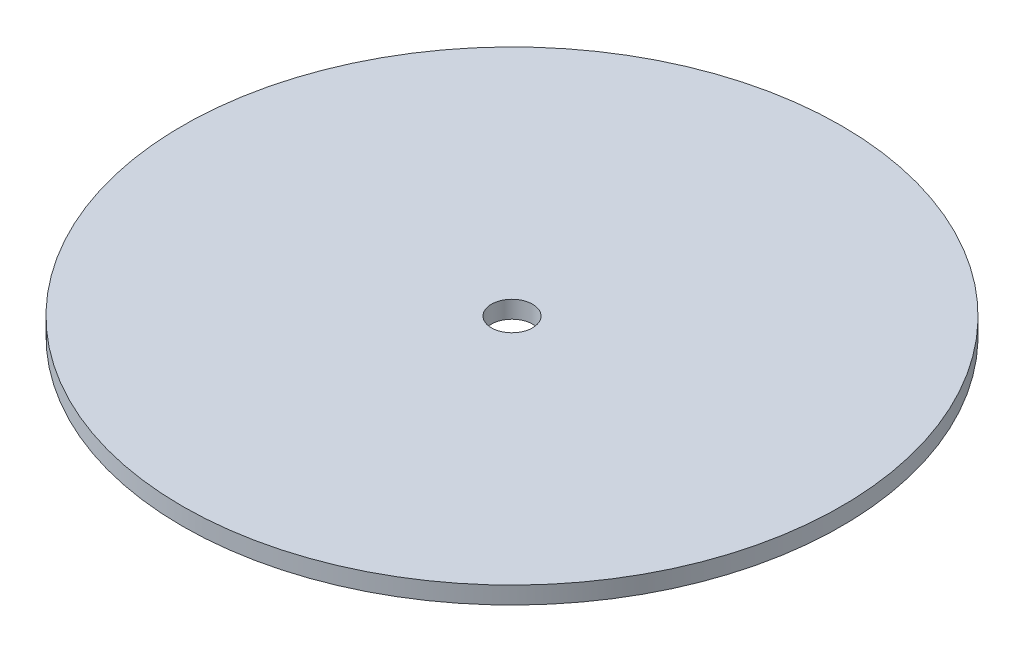
ISO-10303-21;
HEADER;
FILE_DESCRIPTION(('STEP AP214'),'2;1');
FILE_NAME('part.step','',(''),(''),'','','');
FILE_SCHEMA(('AUTOMOTIVE_DESIGN { 1 0 10303 214 1 1 1 1 }'));
ENDSEC;
DATA;
#1=APPLICATION_CONTEXT('core data for automotive mechanical design processes');
#2=APPLICATION_PROTOCOL_DEFINITION('international standard','automotive_design',2000,#1);
#3=PRODUCT_CONTEXT('',#1,'mechanical');
#4=PRODUCT('Part','Part','',(#3));
#5=PRODUCT_RELATED_PRODUCT_CATEGORY('part','',(#4));
#6=PRODUCT_DEFINITION_FORMATION('','',#4);
#7=PRODUCT_DEFINITION_CONTEXT('part definition',#1,'design');
#8=PRODUCT_DEFINITION('design','',#6,#7);
#9=PRODUCT_DEFINITION_SHAPE('','',#8);
#10=(LENGTH_UNIT() NAMED_UNIT(*) SI_UNIT(.MILLI.,.METRE.));
#11=(NAMED_UNIT(*) PLANE_ANGLE_UNIT() SI_UNIT($,.RADIAN.));
#12=(NAMED_UNIT(*) SI_UNIT($,.STERADIAN.) SOLID_ANGLE_UNIT());
#13=UNCERTAINTY_MEASURE_WITH_UNIT(LENGTH_MEASURE(1.E-05),#10,'distance_accuracy_value','');
#14=(GEOMETRIC_REPRESENTATION_CONTEXT(3) GLOBAL_UNCERTAINTY_ASSIGNED_CONTEXT((#13)) GLOBAL_UNIT_ASSIGNED_CONTEXT((#10,
#11,#12)) REPRESENTATION_CONTEXT('',''));
#15=CARTESIAN_POINT('',(0.,0.,0.));
#16=DIRECTION('',(0.,0.,1.));
#17=DIRECTION('',(1.,0.,0.));
#18=AXIS2_PLACEMENT_3D('',#15,#16,#17);
#19=CARTESIAN_POINT('',(0.,4.,0.));
#20=DIRECTION('',(0.,1.,0.));
#21=DIRECTION('',(0.,0.,1.));
#22=AXIS2_PLACEMENT_3D('',#19,#20,#21);
#23=PLANE('',#22);
#24=CARTESIAN_POINT('',(0.,4.,0.));
#25=DIRECTION('',(0.,1.,0.));
#26=DIRECTION('',(0.,0.,1.));
#27=AXIS2_PLACEMENT_3D('',#24,#25,#26);
#28=CIRCLE('',#27,76.2);
#29=CARTESIAN_POINT('',(0.,4.,76.2));
#30=VERTEX_POINT('',#29);
#31=EDGE_CURVE('E10',#30,#30,#28,.T.);
#32=ORIENTED_EDGE('',*,*,#31,.T.);
#33=EDGE_LOOP('',(#32));
#34=FACE_BOUND('',#33,.T.);
#35=CARTESIAN_POINT('',(0.,4.,0.));
#36=DIRECTION('',(0.,1.,0.));
#37=DIRECTION('',(0.,0.,1.));
#38=AXIS2_PLACEMENT_3D('',#35,#36,#37);
#39=CIRCLE('',#38,4.75);
#40=CARTESIAN_POINT('',(0.,4.,4.75));
#41=VERTEX_POINT('',#40);
#42=EDGE_CURVE('E46',#41,#41,#39,.T.);
#43=ORIENTED_EDGE('',*,*,#42,.F.);
#44=EDGE_LOOP('',(#43));
#45=FACE_BOUND('',#44,.T.);
#46=ADVANCED_FACE('F35',(#34,#45),#23,.T.);
#47=CARTESIAN_POINT('',(0.,0.,0.));
#48=DIRECTION('',(0.,1.,0.));
#49=DIRECTION('',(0.,0.,1.));
#50=AXIS2_PLACEMENT_3D('',#47,#48,#49);
#51=PLANE('',#50);
#52=CARTESIAN_POINT('',(0.,0.,0.));
#53=DIRECTION('',(0.,1.,0.));
#54=DIRECTION('',(0.,0.,1.));
#55=AXIS2_PLACEMENT_3D('',#52,#53,#54);
#56=CIRCLE('',#55,76.2);
#57=CARTESIAN_POINT('',(0.,0.,76.2));
#58=VERTEX_POINT('',#57);
#59=EDGE_CURVE('E39',#58,#58,#56,.T.);
#60=ORIENTED_EDGE('',*,*,#59,.F.);
#61=EDGE_LOOP('',(#60));
#62=FACE_BOUND('',#61,.T.);
#63=CARTESIAN_POINT('',(0.,0.,0.));
#64=DIRECTION('',(0.,1.,0.));
#65=DIRECTION('',(0.,0.,1.));
#66=AXIS2_PLACEMENT_3D('',#63,#64,#65);
#67=CIRCLE('',#66,4.75);
#68=CARTESIAN_POINT('',(0.,0.,4.75));
#69=VERTEX_POINT('',#68);
#70=EDGE_CURVE('E48',#69,#69,#67,.T.);
#71=ORIENTED_EDGE('',*,*,#70,.T.);
#72=EDGE_LOOP('',(#71));
#73=FACE_BOUND('',#72,.T.);
#74=ADVANCED_FACE('F58',(#62,#73),#51,.F.);
#75=CARTESIAN_POINT('',(0.,4.,0.));
#76=DIRECTION('',(0.,-1.,0.));
#77=DIRECTION('',(0.,0.,-1.));
#78=AXIS2_PLACEMENT_3D('',#75,#76,#77);
#79=CYLINDRICAL_SURFACE('',#78,76.2);
#80=ORIENTED_EDGE('',*,*,#31,.F.);
#81=EDGE_LOOP('',(#80));
#82=FACE_BOUND('',#81,.T.);
#83=ORIENTED_EDGE('',*,*,#59,.T.);
#84=EDGE_LOOP('',(#83));
#85=FACE_BOUND('',#84,.T.);
#86=ADVANCED_FACE('F37',(#82,#85),#79,.T.);
#87=CARTESIAN_POINT('',(0.,4.,0.));
#88=DIRECTION('',(0.,-1.,0.));
#89=DIRECTION('',(0.,0.,-1.));
#90=AXIS2_PLACEMENT_3D('',#87,#88,#89);
#91=CYLINDRICAL_SURFACE('',#90,4.75);
#92=ORIENTED_EDGE('',*,*,#42,.T.);
#93=EDGE_LOOP('',(#92));
#94=FACE_BOUND('',#93,.T.);
#95=ORIENTED_EDGE('',*,*,#70,.F.);
#96=EDGE_LOOP('',(#95));
#97=FACE_BOUND('',#96,.T.);
#98=ADVANCED_FACE('F54',(#94,#97),#91,.F.);
#99=CLOSED_SHELL('',(#46,#74,#86,#98));
#100=MANIFOLD_SOLID_BREP('B2',#99);
#101=ADVANCED_BREP_SHAPE_REPRESENTATION('',(#18,#100),#14);
#102=SHAPE_DEFINITION_REPRESENTATION(#9,#101);
ENDSEC;
END-ISO-10303-21;
